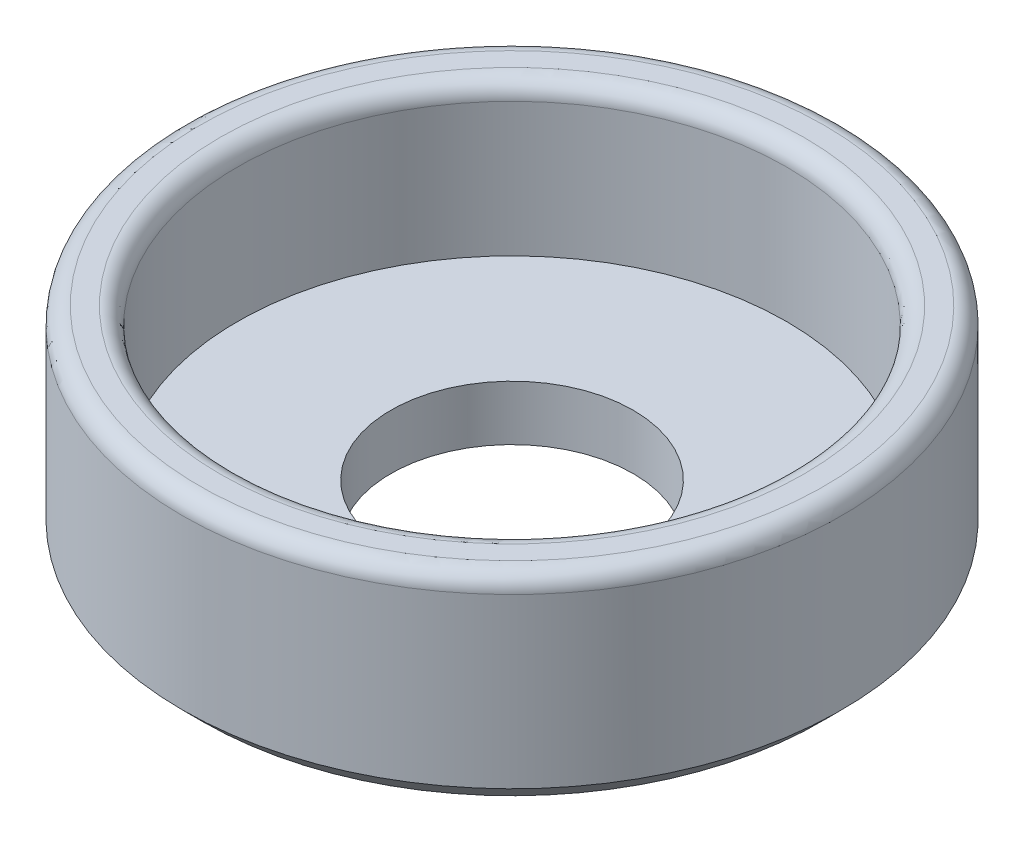
ISO-10303-21;
HEADER;
FILE_DESCRIPTION(('STEP AP214'),'2;1');
FILE_NAME('part.step','',(''),(''),'','','');
FILE_SCHEMA(('AUTOMOTIVE_DESIGN { 1 0 10303 214 1 1 1 1 }'));
ENDSEC;
DATA;
#1=APPLICATION_CONTEXT('core data for automotive mechanical design processes');
#2=APPLICATION_PROTOCOL_DEFINITION('international standard','automotive_design',2000,#1);
#3=PRODUCT_CONTEXT('',#1,'mechanical');
#4=PRODUCT('Part','Part','',(#3));
#5=PRODUCT_RELATED_PRODUCT_CATEGORY('part','',(#4));
#6=PRODUCT_DEFINITION_FORMATION('','',#4);
#7=PRODUCT_DEFINITION_CONTEXT('part definition',#1,'design');
#8=PRODUCT_DEFINITION('design','',#6,#7);
#9=PRODUCT_DEFINITION_SHAPE('','',#8);
#10=(LENGTH_UNIT() NAMED_UNIT(*) SI_UNIT(.MILLI.,.METRE.));
#11=(NAMED_UNIT(*) PLANE_ANGLE_UNIT() SI_UNIT($,.RADIAN.));
#12=(NAMED_UNIT(*) SI_UNIT($,.STERADIAN.) SOLID_ANGLE_UNIT());
#13=UNCERTAINTY_MEASURE_WITH_UNIT(LENGTH_MEASURE(1.E-05),#10,'distance_accuracy_value','');
#14=(GEOMETRIC_REPRESENTATION_CONTEXT(3) GLOBAL_UNCERTAINTY_ASSIGNED_CONTEXT((#13)) GLOBAL_UNIT_ASSIGNED_CONTEXT((#10,
#11,#12)) REPRESENTATION_CONTEXT('',''));
#15=CARTESIAN_POINT('',(0.,0.,0.));
#16=DIRECTION('',(0.,0.,1.));
#17=DIRECTION('',(1.,0.,0.));
#18=AXIS2_PLACEMENT_3D('',#15,#16,#17);
#19=CARTESIAN_POINT('',(0.,0.,0.));
#20=DIRECTION('',(0.,1.,0.));
#21=DIRECTION('',(0.,0.,1.));
#22=AXIS2_PLACEMENT_3D('',#19,#20,#21);
#23=PLANE('',#22);
#24=CARTESIAN_POINT('',(0.,0.,0.));
#25=DIRECTION('',(0.,1.,0.));
#26=DIRECTION('',(0.,0.,1.));
#27=AXIS2_PLACEMENT_3D('',#24,#25,#26);
#28=CIRCLE('',#27,4.5);
#29=CARTESIAN_POINT('',(0.,0.,4.5));
#30=VERTEX_POINT('',#29);
#31=EDGE_CURVE('E10',#30,#30,#28,.F.);
#32=ORIENTED_EDGE('',*,*,#31,.T.);
#33=EDGE_LOOP('',(#32));
#34=FACE_BOUND('',#33,.T.);
#35=CARTESIAN_POINT('',(0.,0.,0.));
#36=DIRECTION('',(0.,1.,0.));
#37=DIRECTION('',(0.,0.,1.));
#38=AXIS2_PLACEMENT_3D('',#35,#36,#37);
#39=CIRCLE('',#38,1.765);
#40=CARTESIAN_POINT('',(0.,0.,1.765));
#41=VERTEX_POINT('',#40);
#42=EDGE_CURVE('E70',#41,#41,#39,.T.);
#43=ORIENTED_EDGE('',*,*,#42,.T.);
#44=EDGE_LOOP('',(#43));
#45=FACE_BOUND('',#44,.T.);
#46=ADVANCED_FACE('F40',(#34,#45),#23,.F.);
#47=CARTESIAN_POINT('',(0.,0.8,0.));
#48=DIRECTION('',(0.,1.,0.));
#49=DIRECTION('',(0.,0.,1.));
#50=AXIS2_PLACEMENT_3D('',#47,#48,#49);
#51=CYLINDRICAL_SURFACE('',#50,4.8);
#52=CARTESIAN_POINT('',(0.,0.300000000000001,0.));
#53=DIRECTION('',(0.,1.,0.));
#54=DIRECTION('',(0.,0.,1.));
#55=AXIS2_PLACEMENT_3D('',#52,#53,#54);
#56=CIRCLE('',#55,4.8);
#57=CARTESIAN_POINT('',(0.,0.300000000000001,4.8));
#58=VERTEX_POINT('',#57);
#59=EDGE_CURVE('E48',#58,#58,#56,.T.);
#60=ORIENTED_EDGE('',*,*,#59,.T.);
#61=EDGE_LOOP('',(#60));
#62=FACE_BOUND('',#61,.T.);
#63=CARTESIAN_POINT('',(0.,2.75,0.));
#64=DIRECTION('',(0.,-1.,0.));
#65=DIRECTION('',(0.,0.,-1.));
#66=AXIS2_PLACEMENT_3D('',#63,#64,#65);
#67=CIRCLE('',#66,4.8);
#68=CARTESIAN_POINT('',(0.,2.75,-4.8));
#69=VERTEX_POINT('',#68);
#70=EDGE_CURVE('E52',#69,#69,#67,.T.);
#71=ORIENTED_EDGE('',*,*,#70,.T.);
#72=EDGE_LOOP('',(#71));
#73=FACE_BOUND('',#72,.T.);
#74=ADVANCED_FACE('F99',(#62,#73),#51,.T.);
#75=CARTESIAN_POINT('',(4.8,3.,0.));
#76=DIRECTION('',(0.,-1.,0.));
#77=DIRECTION('',(0.,0.,-1.));
#78=AXIS2_PLACEMENT_3D('',#75,#76,#77);
#79=PLANE('',#78);
#80=CARTESIAN_POINT('',(0.,3.,0.));
#81=DIRECTION('',(0.,-1.,0.));
#82=DIRECTION('',(0.,0.,-1.));
#83=AXIS2_PLACEMENT_3D('',#80,#81,#82);
#84=CIRCLE('',#83,4.25);
#85=CARTESIAN_POINT('',(0.,3.,-4.25));
#86=VERTEX_POINT('',#85);
#87=EDGE_CURVE('E56',#86,#86,#84,.T.);
#88=ORIENTED_EDGE('',*,*,#87,.T.);
#89=EDGE_LOOP('',(#88));
#90=FACE_BOUND('',#89,.T.);
#91=CARTESIAN_POINT('',(0.,3.,0.));
#92=DIRECTION('',(0.,-1.,0.));
#93=DIRECTION('',(0.,0.,-1.));
#94=AXIS2_PLACEMENT_3D('',#91,#92,#93);
#95=CIRCLE('',#94,4.55);
#96=CARTESIAN_POINT('',(0.,3.,-4.55));
#97=VERTEX_POINT('',#96);
#98=EDGE_CURVE('E61',#97,#97,#95,.F.);
#99=ORIENTED_EDGE('',*,*,#98,.T.);
#100=EDGE_LOOP('',(#99));
#101=FACE_BOUND('',#100,.T.);
#102=ADVANCED_FACE('F93',(#90,#101),#79,.F.);
#103=CARTESIAN_POINT('',(0.,0.8,0.));
#104=DIRECTION('',(0.,1.,0.));
#105=DIRECTION('',(0.,0.,1.));
#106=AXIS2_PLACEMENT_3D('',#103,#104,#105);
#107=CYLINDRICAL_SURFACE('',#106,4.);
#108=CARTESIAN_POINT('',(0.,2.75,0.));
#109=DIRECTION('',(0.,-1.,0.));
#110=DIRECTION('',(0.,0.,-1.));
#111=AXIS2_PLACEMENT_3D('',#108,#109,#110);
#112=CIRCLE('',#111,4.);
#113=CARTESIAN_POINT('',(0.,2.75,-4.));
#114=VERTEX_POINT('',#113);
#115=EDGE_CURVE('E64',#114,#114,#112,.F.);
#116=ORIENTED_EDGE('',*,*,#115,.T.);
#117=EDGE_LOOP('',(#116));
#118=FACE_BOUND('',#117,.T.);
#119=CARTESIAN_POINT('',(0.,0.799999999999999,0.));
#120=DIRECTION('',(0.,1.,0.));
#121=DIRECTION('',(0.,0.,1.));
#122=AXIS2_PLACEMENT_3D('',#119,#120,#121);
#123=CIRCLE('',#122,4.);
#124=CARTESIAN_POINT('',(0.,0.799999999999999,4.));
#125=VERTEX_POINT('',#124);
#126=EDGE_CURVE('E67',#125,#125,#123,.T.);
#127=ORIENTED_EDGE('',*,*,#126,.F.);
#128=EDGE_LOOP('',(#127));
#129=FACE_BOUND('',#128,.T.);
#130=ADVANCED_FACE('F88',(#118,#129),#107,.F.);
#131=CARTESIAN_POINT('',(4.,0.8,0.));
#132=DIRECTION('',(0.,-1.,0.));
#133=DIRECTION('',(0.,0.,-1.));
#134=AXIS2_PLACEMENT_3D('',#131,#132,#133);
#135=PLANE('',#134);
#136=CARTESIAN_POINT('',(0.,0.8,0.));
#137=DIRECTION('',(0.,1.,0.));
#138=DIRECTION('',(0.,0.,1.));
#139=AXIS2_PLACEMENT_3D('',#136,#137,#138);
#140=CIRCLE('',#139,1.765);
#141=CARTESIAN_POINT('',(0.,0.8,1.765));
#142=VERTEX_POINT('',#141);
#143=EDGE_CURVE('E71',#142,#142,#140,.T.);
#144=ORIENTED_EDGE('',*,*,#143,.F.);
#145=EDGE_LOOP('',(#144));
#146=FACE_BOUND('',#145,.T.);
#147=ORIENTED_EDGE('',*,*,#126,.T.);
#148=EDGE_LOOP('',(#147));
#149=FACE_BOUND('',#148,.T.);
#150=ADVANCED_FACE('F82',(#146,#149),#135,.F.);
#151=CARTESIAN_POINT('',(0.,0.,0.));
#152=DIRECTION('',(0.,1.,0.));
#153=DIRECTION('',(0.,0.,1.));
#154=AXIS2_PLACEMENT_3D('',#151,#152,#153);
#155=CYLINDRICAL_SURFACE('',#154,1.765);
#156=ORIENTED_EDGE('',*,*,#42,.F.);
#157=EDGE_LOOP('',(#156));
#158=FACE_BOUND('',#157,.T.);
#159=ORIENTED_EDGE('',*,*,#143,.T.);
#160=EDGE_LOOP('',(#159));
#161=FACE_BOUND('',#160,.T.);
#162=ADVANCED_FACE('F78',(#158,#161),#155,.F.);
#163=CARTESIAN_POINT('',(0.,2.75,0.));
#164=DIRECTION('',(0.,-1.,0.));
#165=DIRECTION('',(0.,0.,-1.));
#166=AXIS2_PLACEMENT_3D('',#163,#164,#165);
#167=TOROIDAL_SURFACE('',#166,4.25,0.25);
#168=ORIENTED_EDGE('',*,*,#87,.F.);
#169=EDGE_LOOP('',(#168));
#170=FACE_BOUND('',#169,.T.);
#171=ORIENTED_EDGE('',*,*,#115,.F.);
#172=EDGE_LOOP('',(#171));
#173=FACE_BOUND('',#172,.T.);
#174=ADVANCED_FACE('F81',(#170,#173),#167,.T.);
#175=CARTESIAN_POINT('',(0.,2.75,0.));
#176=DIRECTION('',(0.,-1.,0.));
#177=DIRECTION('',(0.,0.,-1.));
#178=AXIS2_PLACEMENT_3D('',#175,#176,#177);
#179=TOROIDAL_SURFACE('',#178,4.55,0.25);
#180=ORIENTED_EDGE('',*,*,#70,.F.);
#181=EDGE_LOOP('',(#180));
#182=FACE_BOUND('',#181,.T.);
#183=ORIENTED_EDGE('',*,*,#98,.F.);
#184=EDGE_LOOP('',(#183));
#185=FACE_BOUND('',#184,.T.);
#186=ADVANCED_FACE('F110',(#182,#185),#179,.T.);
#187=CARTESIAN_POINT('',(0.,0.300000000000001,0.));
#188=DIRECTION('',(0.,1.,0.));
#189=DIRECTION('',(0.,0.,1.));
#190=AXIS2_PLACEMENT_3D('',#187,#188,#189);
#191=CONICAL_SURFACE('',#190,4.8,0.785398163397453);
#192=CARTESIAN_POINT('',(0.,0.,4.5));
#193=CARTESIAN_POINT('',(0.,0.00312499999999988,4.503125));
#194=CARTESIAN_POINT('',(0.,0.00624999999999994,4.50625));
#195=CARTESIAN_POINT('',(0.,0.0125,4.51249999999999));
#196=CARTESIAN_POINT('',(0.,0.0156250000000001,4.515625));
#197=CARTESIAN_POINT('',(0.,0.0218750000000001,4.521875));
#198=CARTESIAN_POINT('',(0.,0.025,4.525));
#199=CARTESIAN_POINT('',(0.,0.03125,4.53125));
#200=CARTESIAN_POINT('',(0.,0.034375,4.534375));
#201=CARTESIAN_POINT('',(0.,0.0406250000000001,4.540625));
#202=CARTESIAN_POINT('',(0.,0.0437500000000002,4.54375));
#203=CARTESIAN_POINT('',(0.,0.0500000000000001,4.55));
#204=CARTESIAN_POINT('',(0.,0.053125,4.553125));
#205=CARTESIAN_POINT('',(0.,0.059375,4.559375));
#206=CARTESIAN_POINT('',(0.,0.0625000000000001,4.5625));
#207=CARTESIAN_POINT('',(0.,0.0687500000000002,4.56875));
#208=CARTESIAN_POINT('',(0.,0.0718750000000002,4.571875));
#209=CARTESIAN_POINT('',(0.,0.0781250000000002,4.578125));
#210=CARTESIAN_POINT('',(0.,0.0812500000000001,4.58125));
#211=CARTESIAN_POINT('',(0.,0.0875000000000001,4.5875));
#212=CARTESIAN_POINT('',(0.,0.0906250000000001,4.590625));
#213=CARTESIAN_POINT('',(0.,0.0968750000000002,4.596875));
#214=CARTESIAN_POINT('',(0.,0.1,4.6));
#215=CARTESIAN_POINT('',(0.,0.10625,4.60625));
#216=CARTESIAN_POINT('',(0.,0.109375,4.609375));
#217=CARTESIAN_POINT('',(0.,0.115625,4.615625));
#218=CARTESIAN_POINT('',(0.,0.11875,4.61875));
#219=CARTESIAN_POINT('',(0.,0.125,4.625));
#220=CARTESIAN_POINT('',(0.,0.128125,4.628125));
#221=CARTESIAN_POINT('',(0.,0.134375,4.634375));
#222=CARTESIAN_POINT('',(0.,0.1375,4.6375));
#223=CARTESIAN_POINT('',(0.,0.14375,4.64375));
#224=CARTESIAN_POINT('',(0.,0.146875,4.646875));
#225=CARTESIAN_POINT('',(0.,0.153125,4.653125));
#226=CARTESIAN_POINT('',(0.,0.15625,4.65625));
#227=CARTESIAN_POINT('',(0.,0.1625,4.6625));
#228=CARTESIAN_POINT('',(0.,0.165625,4.665625));
#229=CARTESIAN_POINT('',(0.,0.171875,4.671875));
#230=CARTESIAN_POINT('',(0.,0.175,4.675));
#231=CARTESIAN_POINT('',(0.,0.18125,4.68125));
#232=CARTESIAN_POINT('',(0.,0.184375000000001,4.684375));
#233=CARTESIAN_POINT('',(0.,0.190625,4.690625));
#234=CARTESIAN_POINT('',(0.,0.19375,4.69375));
#235=CARTESIAN_POINT('',(0.,0.2,4.7));
#236=CARTESIAN_POINT('',(0.,0.203125,4.703125));
#237=CARTESIAN_POINT('',(0.,0.209375000000001,4.709375));
#238=CARTESIAN_POINT('',(0.,0.2125,4.7125));
#239=CARTESIAN_POINT('',(0.,0.218750000000001,4.71875));
#240=CARTESIAN_POINT('',(0.,0.221875000000001,4.721875));
#241=CARTESIAN_POINT('',(0.,0.228125000000001,4.728125));
#242=CARTESIAN_POINT('',(0.,0.231250000000001,4.73125));
#243=CARTESIAN_POINT('',(0.,0.2375,4.7375));
#244=CARTESIAN_POINT('',(0.,0.240625000000001,4.740625));
#245=CARTESIAN_POINT('',(0.,0.246875000000001,4.746875));
#246=CARTESIAN_POINT('',(0.,0.250000000000001,4.75));
#247=CARTESIAN_POINT('',(0.,0.256250000000001,4.75625));
#248=CARTESIAN_POINT('',(0.,0.259375000000001,4.759375));
#249=CARTESIAN_POINT('',(0.,0.265625000000001,4.765625));
#250=CARTESIAN_POINT('',(0.,0.268750000000001,4.76875));
#251=CARTESIAN_POINT('',(0.,0.275000000000001,4.775));
#252=CARTESIAN_POINT('',(0.,0.278125000000001,4.778125));
#253=CARTESIAN_POINT('',(0.,0.284375000000001,4.784375));
#254=CARTESIAN_POINT('',(0.,0.287500000000001,4.7875));
#255=CARTESIAN_POINT('',(0.,0.293750000000001,4.79375));
#256=CARTESIAN_POINT('',(0.,0.296875000000001,4.796875));
#257=CARTESIAN_POINT('',(0.,0.300000000000001,4.8));
#258=B_SPLINE_CURVE_WITH_KNOTS('',3,(#192,#193,#194,#195,#196,#197,#198,#199,#200,#201,#202,
#203,#204,#205,#206,#207,#208,#209,#210,#211,#212,#213,#214,#215,#216,#217,#218,#219,#220,#221,
#222,#223,#224,#225,#226,#227,#228,#229,#230,#231,#232,#233,#234,#235,#236,#237,#238,#239,#240,
#241,#242,#243,#244,#245,#246,#247,#248,#249,#250,#251,#252,#253,#254,#255,#256,#257),
.UNSPECIFIED.,.F.,.F.,(4,2,2,2,2,2,2,2,2,2,2,2,2,2,2,2,2,2,2,2,2,2,2,2,2,2,2,2,2,2,2,2,4),(0.,
0.0132582521472477,0.0265165042944953,0.0397747564417436,0.0530330085889913,0.066291260736239,
0.0795495128834872,0.0928077650307349,0.106066017177983,0.119324269325231,0.132582521472479,
0.145840773619726,0.159099025766974,0.172357277914222,0.18561553006147,0.198873782208718,
0.212132034355966,0.225390286503213,0.238648538650462,0.251906790797709,0.265165042944957,
0.278423295092205,0.291681547239453,0.304939799386701,0.318198051533948,0.331456303681197,
0.344714555828444,0.357972807975692,0.37123106012294,0.384489312270188,0.397747564417436,
0.411005816564684,0.424264068711932),.UNSPECIFIED.);
#259=EDGE_CURVE('BSEAM43',#30,#58,#258,.T.);
#260=ORIENTED_EDGE('',*,*,#31,.F.);
#261=ORIENTED_EDGE('',*,*,#59,.F.);
#262=ORIENTED_EDGE('',*,*,#259,.T.);
#263=ORIENTED_EDGE('',*,*,#259,.F.);
#264=EDGE_LOOP('',(#260,#262,#261,#263));
#265=FACE_BOUND('',#264,.T.);
#266=ADVANCED_FACE('F43',(#265),#191,.T.);
#267=CLOSED_SHELL('',(#46,#74,#102,#130,#150,#162,#174,#186,#266));
#268=MANIFOLD_SOLID_BREP('B2',#267);
#269=ADVANCED_BREP_SHAPE_REPRESENTATION('',(#18,#268),#14);
#270=SHAPE_DEFINITION_REPRESENTATION(#9,#269);
ENDSEC;
END-ISO-10303-21;
